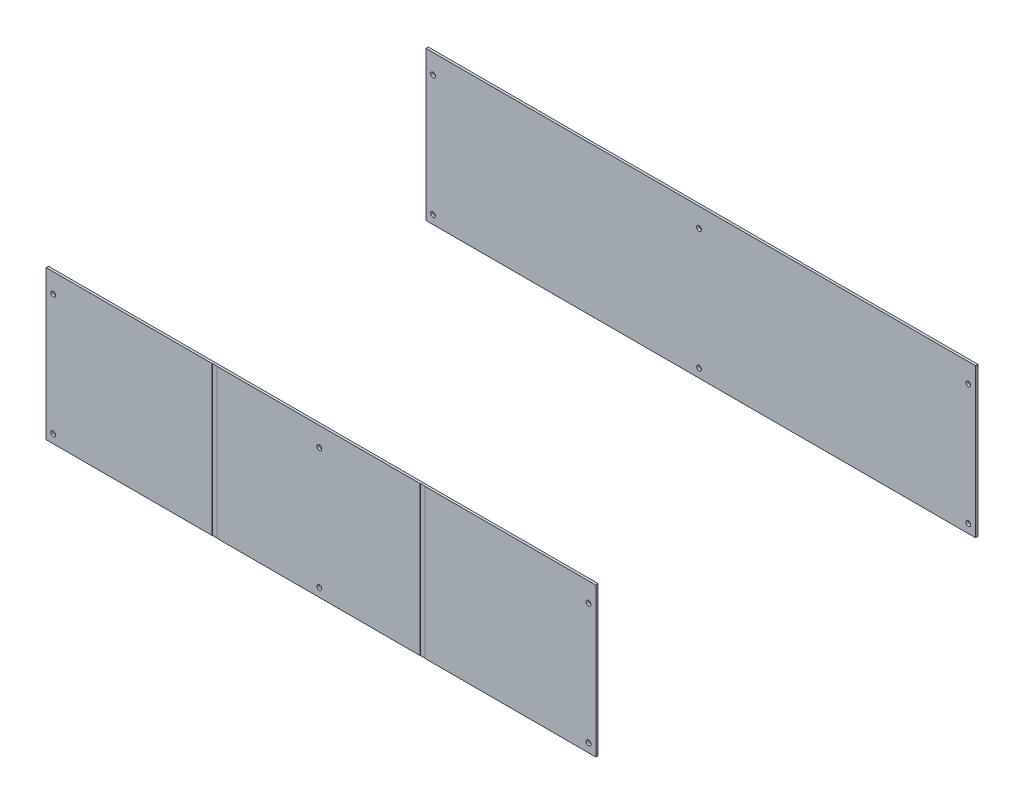
ISO-10303-21;
HEADER;
FILE_DESCRIPTION(('STEP AP214'),'2;1');
FILE_NAME('part.step','',(''),(''),'','','');
FILE_SCHEMA(('AUTOMOTIVE_DESIGN { 1 0 10303 214 1 1 1 1 }'));
ENDSEC;
DATA;
#1=APPLICATION_CONTEXT('core data for automotive mechanical design processes');
#2=APPLICATION_PROTOCOL_DEFINITION('international standard','automotive_design',2000,#1);
#3=PRODUCT_CONTEXT('',#1,'mechanical');
#4=PRODUCT('Part','Part','',(#3));
#5=PRODUCT_RELATED_PRODUCT_CATEGORY('part','',(#4));
#6=PRODUCT_DEFINITION_FORMATION('','',#4);
#7=PRODUCT_DEFINITION_CONTEXT('part definition',#1,'design');
#8=PRODUCT_DEFINITION('design','',#6,#7);
#9=PRODUCT_DEFINITION_SHAPE('','',#8);
#10=(LENGTH_UNIT() NAMED_UNIT(*) SI_UNIT(.MILLI.,.METRE.));
#11=(NAMED_UNIT(*) PLANE_ANGLE_UNIT() SI_UNIT($,.RADIAN.));
#12=(NAMED_UNIT(*) SI_UNIT($,.STERADIAN.) SOLID_ANGLE_UNIT());
#13=UNCERTAINTY_MEASURE_WITH_UNIT(LENGTH_MEASURE(1.E-05),#10,'distance_accuracy_value','');
#14=(GEOMETRIC_REPRESENTATION_CONTEXT(3) GLOBAL_UNCERTAINTY_ASSIGNED_CONTEXT((#13)) GLOBAL_UNIT_ASSIGNED_CONTEXT((#10,
#11,#12)) REPRESENTATION_CONTEXT('',''));
#15=CARTESIAN_POINT('',(0.,0.,0.));
#16=DIRECTION('',(0.,0.,1.));
#17=DIRECTION('',(1.,0.,0.));
#18=AXIS2_PLACEMENT_3D('',#15,#16,#17);
#19=CARTESIAN_POINT('',(0.,0.,-785.));
#20=DIRECTION('',(0.,0.,-1.));
#21=DIRECTION('',(1.,0.,0.));
#22=AXIS2_PLACEMENT_3D('',#19,#20,#21);
#23=PLANE('',#22);
#24=CARTESIAN_POINT('',(-3.2500000000002,114.,-785.));
#25=DIRECTION('',(0.,0.,-1.));
#26=DIRECTION('',(-1.,0.,0.));
#27=AXIS2_PLACEMENT_3D('',#24,#25,#26);
#28=CIRCLE('',#27,5.00000000000005);
#29=CARTESIAN_POINT('',(-8.25000000000024,114.,-785.));
#30=VERTEX_POINT('',#29);
#31=EDGE_CURVE('E299',#30,#30,#28,.T.);
#32=ORIENTED_EDGE('',*,*,#31,.F.);
#33=EDGE_LOOP('',(#32));
#34=FACE_BOUND('',#33,.T.);
#35=CARTESIAN_POINT('',(-3.24999999999998,-136.,-785.));
#36=DIRECTION('',(0.,0.,-1.));
#37=DIRECTION('',(1.,0.,0.));
#38=AXIS2_PLACEMENT_3D('',#35,#36,#37);
#39=CIRCLE('',#38,5.00000000000005);
#40=CARTESIAN_POINT('',(1.75000000000007,-136.,-785.));
#41=VERTEX_POINT('',#40);
#42=EDGE_CURVE('E305',#41,#41,#39,.T.);
#43=ORIENTED_EDGE('',*,*,#42,.F.);
#44=EDGE_LOOP('',(#43));
#45=FACE_BOUND('',#44,.T.);
#46=DIRECTION('',(-1.,0.,0.));
#47=VECTOR('',#46,1.);
#48=CARTESIAN_POINT('',(-568.25,154.,-785.));
#49=LINE('',#48,#47);
#50=CARTESIAN_POINT('',(205.,154.,-785.));
#51=VERTEX_POINT('',#50);
#52=CARTESIAN_POINT('',(-215.,154.,-785.));
#53=VERTEX_POINT('',#52);
#54=EDGE_CURVE('E202',#51,#53,#49,.T.);
#55=ORIENTED_EDGE('',*,*,#54,.F.);
#56=DIRECTION('',(0.,1.,0.));
#57=VECTOR('',#56,1.);
#58=CARTESIAN_POINT('',(205.,154.,-785.));
#59=LINE('',#58,#57);
#60=CARTESIAN_POINT('',(205.,-154.,-785.));
#61=VERTEX_POINT('',#60);
#62=EDGE_CURVE('E183',#51,#61,#59,.F.);
#63=ORIENTED_EDGE('',*,*,#62,.T.);
#64=DIRECTION('',(1.,0.,0.));
#65=VECTOR('',#64,1.);
#66=CARTESIAN_POINT('',(-568.25,-154.,-785.));
#67=LINE('',#66,#65);
#68=CARTESIAN_POINT('',(-215.,-154.,-785.));
#69=VERTEX_POINT('',#68);
#70=EDGE_CURVE('E208',#69,#61,#67,.T.);
#71=ORIENTED_EDGE('',*,*,#70,.F.);
#72=DIRECTION('',(0.,-1.,0.));
#73=VECTOR('',#72,1.);
#74=CARTESIAN_POINT('',(-215.,154.,-785.));
#75=LINE('',#74,#73);
#76=EDGE_CURVE('E148',#53,#69,#75,.T.);
#77=ORIENTED_EDGE('',*,*,#76,.F.);
#78=EDGE_LOOP('',(#55,#63,#71,#77));
#79=FACE_BOUND('',#78,.T.);
#80=ADVANCED_FACE('F44',(#34,#45,#79),#23,.T.);
#81=CARTESIAN_POINT('',(553.25,114.,-785.));
#82=DIRECTION('',(0.,0.,-1.));
#83=DIRECTION('',(-1.,0.,0.));
#84=AXIS2_PLACEMENT_3D('',#81,#82,#83);
#85=CIRCLE('',#84,5.00000000000005);
#86=CARTESIAN_POINT('',(548.25,114.,-785.));
#87=VERTEX_POINT('',#86);
#88=EDGE_CURVE('E284',#87,#87,#85,.T.);
#89=ORIENTED_EDGE('',*,*,#88,.F.);
#90=EDGE_LOOP('',(#89));
#91=FACE_BOUND('',#90,.T.);
#92=CARTESIAN_POINT('',(553.25,-136.,-785.));
#93=DIRECTION('',(0.,0.,-1.));
#94=DIRECTION('',(1.,0.,0.));
#95=AXIS2_PLACEMENT_3D('',#92,#93,#94);
#96=CIRCLE('',#95,5.00000000000005);
#97=CARTESIAN_POINT('',(558.25,-136.,-785.));
#98=VERTEX_POINT('',#97);
#99=EDGE_CURVE('E287',#98,#98,#96,.T.);
#100=ORIENTED_EDGE('',*,*,#99,.F.);
#101=EDGE_LOOP('',(#100));
#102=FACE_BOUND('',#101,.T.);
#103=CARTESIAN_POINT('',(568.25,154.,-785.));
#104=VERTEX_POINT('',#103);
#105=CARTESIAN_POINT('',(215.,154.,-785.));
#106=VERTEX_POINT('',#105);
#107=EDGE_CURVE('E198',#104,#106,#49,.T.);
#108=ORIENTED_EDGE('',*,*,#107,.F.);
#109=DIRECTION('',(0.,1.,0.));
#110=VECTOR('',#109,1.);
#111=CARTESIAN_POINT('',(568.25,154.,-785.));
#112=LINE('',#111,#110);
#113=CARTESIAN_POINT('',(568.25,-154.,-785.));
#114=VERTEX_POINT('',#113);
#115=EDGE_CURVE('E193',#114,#104,#112,.T.);
#116=ORIENTED_EDGE('',*,*,#115,.F.);
#117=CARTESIAN_POINT('',(215.,-154.,-785.));
#118=VERTEX_POINT('',#117);
#119=EDGE_CURVE('E205',#118,#114,#67,.T.);
#120=ORIENTED_EDGE('',*,*,#119,.F.);
#121=DIRECTION('',(0.,-1.,0.));
#122=VECTOR('',#121,1.);
#123=CARTESIAN_POINT('',(215.,154.,-785.));
#124=LINE('',#123,#122);
#125=EDGE_CURVE('E174',#106,#118,#124,.T.);
#126=ORIENTED_EDGE('',*,*,#125,.F.);
#127=EDGE_LOOP('',(#108,#116,#120,#126));
#128=FACE_BOUND('',#127,.T.);
#129=ADVANCED_FACE('F240',(#91,#102,#128),#23,.T.);
#130=CARTESIAN_POINT('',(568.25,154.,-785.));
#131=DIRECTION('',(-1.,0.,0.));
#132=DIRECTION('',(0.,-1.,0.));
#133=AXIS2_PLACEMENT_3D('',#130,#131,#132);
#134=PLANE('',#133);
#135=DIRECTION('',(0.,1.,0.));
#136=VECTOR('',#135,1.);
#137=CARTESIAN_POINT('',(568.25,154.,-780.));
#138=LINE('',#137,#136);
#139=CARTESIAN_POINT('',(568.25,-154.,-780.));
#140=VERTEX_POINT('',#139);
#141=CARTESIAN_POINT('',(568.25,154.,-780.));
#142=VERTEX_POINT('',#141);
#143=EDGE_CURVE('E167',#140,#142,#138,.T.);
#144=ORIENTED_EDGE('',*,*,#143,.F.);
#145=DIRECTION('',(0.,0.,1.));
#146=VECTOR('',#145,1.);
#147=CARTESIAN_POINT('',(568.25,-154.,-785.));
#148=LINE('',#147,#146);
#149=EDGE_CURVE('E207',#114,#140,#148,.T.);
#150=ORIENTED_EDGE('',*,*,#149,.F.);
#151=ORIENTED_EDGE('',*,*,#115,.T.);
#152=DIRECTION('',(0.,0.,1.));
#153=VECTOR('',#152,1.);
#154=CARTESIAN_POINT('',(568.25,154.,-785.));
#155=LINE('',#154,#153);
#156=EDGE_CURVE('E12',#104,#142,#155,.T.);
#157=ORIENTED_EDGE('',*,*,#156,.T.);
#158=EDGE_LOOP('',(#144,#150,#151,#157));
#159=FACE_BOUND('',#158,.T.);
#160=ADVANCED_FACE('F46',(#159),#134,.F.);
#161=CARTESIAN_POINT('',(-568.25,154.,-785.));
#162=DIRECTION('',(0.,-1.,0.));
#163=DIRECTION('',(0.,0.,1.));
#164=AXIS2_PLACEMENT_3D('',#161,#162,#163);
#165=PLANE('',#164);
#166=CARTESIAN_POINT('',(-225.,154.,-785.));
#167=VERTEX_POINT('',#166);
#168=CARTESIAN_POINT('',(-568.25,154.,-785.));
#169=VERTEX_POINT('',#168);
#170=EDGE_CURVE('E196',#167,#169,#49,.T.);
#171=ORIENTED_EDGE('',*,*,#170,.T.);
#172=DIRECTION('',(0.,0.,1.));
#173=VECTOR('',#172,1.);
#174=CARTESIAN_POINT('',(-568.25,154.,-785.));
#175=LINE('',#174,#173);
#176=CARTESIAN_POINT('',(-568.25,154.,-780.));
#177=VERTEX_POINT('',#176);
#178=EDGE_CURVE('E52',#169,#177,#175,.T.);
#179=ORIENTED_EDGE('',*,*,#178,.T.);
#180=DIRECTION('',(-1.,0.,0.));
#181=VECTOR('',#180,1.);
#182=CARTESIAN_POINT('',(-568.25,154.,-780.));
#183=LINE('',#182,#181);
#184=EDGE_CURVE('E211',#142,#177,#183,.T.);
#185=ORIENTED_EDGE('',*,*,#184,.F.);
#186=ORIENTED_EDGE('',*,*,#156,.F.);
#187=ORIENTED_EDGE('',*,*,#107,.T.);
#188=DIRECTION('',(0.,0.,-1.));
#189=VECTOR('',#188,1.);
#190=CARTESIAN_POINT('',(215.,154.,-784.5));
#191=LINE('',#190,#189);
#192=CARTESIAN_POINT('',(215.,154.,-784.5));
#193=VERTEX_POINT('',#192);
#194=EDGE_CURVE('E189',#193,#106,#191,.T.);
#195=ORIENTED_EDGE('',*,*,#194,.F.);
#196=DIRECTION('',(1.,0.,0.));
#197=VECTOR('',#196,1.);
#198=CARTESIAN_POINT('',(205.,154.,-784.5));
#199=LINE('',#198,#197);
#200=CARTESIAN_POINT('',(205.,154.,-784.5));
#201=VERTEX_POINT('',#200);
#202=EDGE_CURVE('E179',#201,#193,#199,.T.);
#203=ORIENTED_EDGE('',*,*,#202,.F.);
#204=DIRECTION('',(0.,0.,-1.));
#205=VECTOR('',#204,1.);
#206=CARTESIAN_POINT('',(205.,154.,-784.5));
#207=LINE('',#206,#205);
#208=EDGE_CURVE('E164',#201,#51,#207,.T.);
#209=ORIENTED_EDGE('',*,*,#208,.T.);
#210=ORIENTED_EDGE('',*,*,#54,.T.);
#211=DIRECTION('',(0.,0.,-1.));
#212=VECTOR('',#211,1.);
#213=CARTESIAN_POINT('',(-215.,154.,-784.5));
#214=LINE('',#213,#212);
#215=CARTESIAN_POINT('',(-215.,154.,-784.5));
#216=VERTEX_POINT('',#215);
#217=EDGE_CURVE('E168',#216,#53,#214,.T.);
#218=ORIENTED_EDGE('',*,*,#217,.F.);
#219=DIRECTION('',(1.,0.,0.));
#220=VECTOR('',#219,1.);
#221=CARTESIAN_POINT('',(-225.,154.,-784.5));
#222=LINE('',#221,#220);
#223=CARTESIAN_POINT('',(-225.,154.,-784.5));
#224=VERTEX_POINT('',#223);
#225=EDGE_CURVE('E153',#224,#216,#222,.T.);
#226=ORIENTED_EDGE('',*,*,#225,.F.);
#227=DIRECTION('',(0.,0.,-1.));
#228=VECTOR('',#227,1.);
#229=CARTESIAN_POINT('',(-225.,154.,-784.5));
#230=LINE('',#229,#228);
#231=EDGE_CURVE('E142',#224,#167,#230,.T.);
#232=ORIENTED_EDGE('',*,*,#231,.T.);
#233=EDGE_LOOP('',(#171,#179,#185,#186,#187,#195,#203,#209,#210,#218,#226,#232));
#234=FACE_BOUND('',#233,.T.);
#235=ADVANCED_FACE('F226',(#234),#165,.F.);
#236=CARTESIAN_POINT('',(-568.25,154.,-785.));
#237=DIRECTION('',(1.,0.,0.));
#238=DIRECTION('',(0.,1.,0.));
#239=AXIS2_PLACEMENT_3D('',#236,#237,#238);
#240=PLANE('',#239);
#241=DIRECTION('',(0.,-1.,0.));
#242=VECTOR('',#241,1.);
#243=CARTESIAN_POINT('',(-568.25,154.,-780.));
#244=LINE('',#243,#242);
#245=CARTESIAN_POINT('',(-568.25,-154.,-780.));
#246=VERTEX_POINT('',#245);
#247=EDGE_CURVE('E214',#177,#246,#244,.T.);
#248=ORIENTED_EDGE('',*,*,#247,.F.);
#249=ORIENTED_EDGE('',*,*,#178,.F.);
#250=DIRECTION('',(0.,-1.,0.));
#251=VECTOR('',#250,1.);
#252=CARTESIAN_POINT('',(-568.25,154.,-785.));
#253=LINE('',#252,#251);
#254=CARTESIAN_POINT('',(-568.25,-154.,-785.));
#255=VERTEX_POINT('',#254);
#256=EDGE_CURVE('E201',#169,#255,#253,.T.);
#257=ORIENTED_EDGE('',*,*,#256,.T.);
#258=DIRECTION('',(0.,0.,1.));
#259=VECTOR('',#258,1.);
#260=CARTESIAN_POINT('',(-568.25,-154.,-785.));
#261=LINE('',#260,#259);
#262=EDGE_CURVE('E220',#255,#246,#261,.T.);
#263=ORIENTED_EDGE('',*,*,#262,.T.);
#264=EDGE_LOOP('',(#248,#249,#257,#263));
#265=FACE_BOUND('',#264,.T.);
#266=ADVANCED_FACE('F229',(#265),#240,.F.);
#267=CARTESIAN_POINT('',(-568.25,-154.,-785.));
#268=DIRECTION('',(0.,1.,0.));
#269=DIRECTION('',(0.,0.,-1.));
#270=AXIS2_PLACEMENT_3D('',#267,#268,#269);
#271=PLANE('',#270);
#272=DIRECTION('',(-1.,0.,0.));
#273=VECTOR('',#272,1.);
#274=CARTESIAN_POINT('',(-215.,-154.,-784.5));
#275=LINE('',#274,#273);
#276=CARTESIAN_POINT('',(-215.,-154.,-784.5));
#277=VERTEX_POINT('',#276);
#278=CARTESIAN_POINT('',(-225.,-154.,-784.5));
#279=VERTEX_POINT('',#278);
#280=EDGE_CURVE('E147',#277,#279,#275,.T.);
#281=ORIENTED_EDGE('',*,*,#280,.F.);
#282=DIRECTION('',(0.,0.,-1.));
#283=VECTOR('',#282,1.);
#284=CARTESIAN_POINT('',(-215.,-154.,-784.5));
#285=LINE('',#284,#283);
#286=EDGE_CURVE('E66',#277,#69,#285,.T.);
#287=ORIENTED_EDGE('',*,*,#286,.T.);
#288=ORIENTED_EDGE('',*,*,#70,.T.);
#289=DIRECTION('',(0.,0.,-1.));
#290=VECTOR('',#289,1.);
#291=CARTESIAN_POINT('',(205.,-154.,-784.5));
#292=LINE('',#291,#290);
#293=CARTESIAN_POINT('',(205.,-154.,-784.5));
#294=VERTEX_POINT('',#293);
#295=EDGE_CURVE('E182',#294,#61,#292,.T.);
#296=ORIENTED_EDGE('',*,*,#295,.F.);
#297=DIRECTION('',(-1.,0.,0.));
#298=VECTOR('',#297,1.);
#299=CARTESIAN_POINT('',(215.,-154.,-784.5));
#300=LINE('',#299,#298);
#301=CARTESIAN_POINT('',(215.,-154.,-784.5));
#302=VERTEX_POINT('',#301);
#303=EDGE_CURVE('E173',#302,#294,#300,.T.);
#304=ORIENTED_EDGE('',*,*,#303,.F.);
#305=DIRECTION('',(0.,0.,-1.));
#306=VECTOR('',#305,1.);
#307=CARTESIAN_POINT('',(215.,-154.,-784.5));
#308=LINE('',#307,#306);
#309=EDGE_CURVE('E59',#302,#118,#308,.T.);
#310=ORIENTED_EDGE('',*,*,#309,.T.);
#311=ORIENTED_EDGE('',*,*,#119,.T.);
#312=ORIENTED_EDGE('',*,*,#149,.T.);
#313=DIRECTION('',(1.,0.,0.));
#314=VECTOR('',#313,1.);
#315=CARTESIAN_POINT('',(-568.25,-154.,-780.));
#316=LINE('',#315,#314);
#317=EDGE_CURVE('E197',#246,#140,#316,.T.);
#318=ORIENTED_EDGE('',*,*,#317,.F.);
#319=ORIENTED_EDGE('',*,*,#262,.F.);
#320=CARTESIAN_POINT('',(-225.,-154.,-785.));
#321=VERTEX_POINT('',#320);
#322=EDGE_CURVE('E152',#255,#321,#67,.T.);
#323=ORIENTED_EDGE('',*,*,#322,.T.);
#324=DIRECTION('',(0.,0.,-1.));
#325=VECTOR('',#324,1.);
#326=CARTESIAN_POINT('',(-225.,-154.,-784.5));
#327=LINE('',#326,#325);
#328=EDGE_CURVE('E139',#279,#321,#327,.T.);
#329=ORIENTED_EDGE('',*,*,#328,.F.);
#330=EDGE_LOOP('',(#281,#287,#288,#296,#304,#310,#311,#312,#318,#319,#323,#329));
#331=FACE_BOUND('',#330,.T.);
#332=ADVANCED_FACE('F150',(#331),#271,.F.);
#333=CARTESIAN_POINT('',(-553.25,114.,-785.));
#334=DIRECTION('',(0.,0.,1.));
#335=DIRECTION('',(1.,0.,0.));
#336=AXIS2_PLACEMENT_3D('',#333,#334,#335);
#337=CIRCLE('',#336,5.00000000000005);
#338=CARTESIAN_POINT('',(-548.25,114.,-785.));
#339=VERTEX_POINT('',#338);
#340=EDGE_CURVE('E311',#339,#339,#337,.T.);
#341=ORIENTED_EDGE('',*,*,#340,.T.);
#342=EDGE_LOOP('',(#341));
#343=FACE_BOUND('',#342,.T.);
#344=CARTESIAN_POINT('',(-553.25,-136.,-785.));
#345=DIRECTION('',(0.,0.,1.));
#346=DIRECTION('',(-1.,0.,0.));
#347=AXIS2_PLACEMENT_3D('',#344,#345,#346);
#348=CIRCLE('',#347,5.00000000000005);
#349=CARTESIAN_POINT('',(-558.25,-136.,-785.));
#350=VERTEX_POINT('',#349);
#351=EDGE_CURVE('E298',#350,#350,#348,.T.);
#352=ORIENTED_EDGE('',*,*,#351,.T.);
#353=EDGE_LOOP('',(#352));
#354=FACE_BOUND('',#353,.T.);
#355=DIRECTION('',(0.,-1.,0.));
#356=VECTOR('',#355,1.);
#357=CARTESIAN_POINT('',(-225.,154.,-785.));
#358=LINE('',#357,#356);
#359=EDGE_CURVE('E162',#167,#321,#358,.T.);
#360=ORIENTED_EDGE('',*,*,#359,.T.);
#361=ORIENTED_EDGE('',*,*,#322,.F.);
#362=ORIENTED_EDGE('',*,*,#256,.F.);
#363=ORIENTED_EDGE('',*,*,#170,.F.);
#364=EDGE_LOOP('',(#360,#361,#362,#363));
#365=FACE_BOUND('',#364,.T.);
#366=ADVANCED_FACE('F260',(#343,#354,#365),#23,.T.);
#367=CARTESIAN_POINT('',(0.,0.,-780.));
#368=DIRECTION('',(0.,0.,-1.));
#369=DIRECTION('',(1.,0.,0.));
#370=AXIS2_PLACEMENT_3D('',#367,#368,#369);
#371=PLANE('',#370);
#372=CARTESIAN_POINT('',(553.25,114.,-780.));
#373=DIRECTION('',(0.,0.,-1.));
#374=DIRECTION('',(-1.,0.,0.));
#375=AXIS2_PLACEMENT_3D('',#372,#373,#374);
#376=CIRCLE('',#375,5.00000000000005);
#377=CARTESIAN_POINT('',(548.25,114.,-780.));
#378=VERTEX_POINT('',#377);
#379=EDGE_CURVE('E308',#378,#378,#376,.T.);
#380=ORIENTED_EDGE('',*,*,#379,.T.);
#381=EDGE_LOOP('',(#380));
#382=FACE_BOUND('',#381,.T.);
#383=CARTESIAN_POINT('',(553.25,-136.,-780.));
#384=DIRECTION('',(0.,0.,-1.));
#385=DIRECTION('',(1.,0.,0.));
#386=AXIS2_PLACEMENT_3D('',#383,#384,#385);
#387=CIRCLE('',#386,5.00000000000005);
#388=CARTESIAN_POINT('',(558.25,-136.,-780.));
#389=VERTEX_POINT('',#388);
#390=EDGE_CURVE('E289',#389,#389,#387,.T.);
#391=ORIENTED_EDGE('',*,*,#390,.T.);
#392=EDGE_LOOP('',(#391));
#393=FACE_BOUND('',#392,.T.);
#394=CARTESIAN_POINT('',(-3.2500000000002,114.,-780.));
#395=DIRECTION('',(0.,0.,-1.));
#396=DIRECTION('',(-1.,0.,0.));
#397=AXIS2_PLACEMENT_3D('',#394,#395,#396);
#398=CIRCLE('',#397,5.00000000000005);
#399=CARTESIAN_POINT('',(-8.25000000000024,114.,-780.));
#400=VERTEX_POINT('',#399);
#401=EDGE_CURVE('E295',#400,#400,#398,.T.);
#402=ORIENTED_EDGE('',*,*,#401,.T.);
#403=EDGE_LOOP('',(#402));
#404=FACE_BOUND('',#403,.T.);
#405=CARTESIAN_POINT('',(-3.24999999999998,-136.,-780.));
#406=DIRECTION('',(0.,0.,-1.));
#407=DIRECTION('',(1.,0.,0.));
#408=AXIS2_PLACEMENT_3D('',#405,#406,#407);
#409=CIRCLE('',#408,5.00000000000005);
#410=CARTESIAN_POINT('',(1.75000000000007,-136.,-780.));
#411=VERTEX_POINT('',#410);
#412=EDGE_CURVE('E302',#411,#411,#409,.T.);
#413=ORIENTED_EDGE('',*,*,#412,.T.);
#414=EDGE_LOOP('',(#413));
#415=FACE_BOUND('',#414,.T.);
#416=CARTESIAN_POINT('',(-553.25,114.,-780.));
#417=DIRECTION('',(0.,0.,1.));
#418=DIRECTION('',(1.,0.,0.));
#419=AXIS2_PLACEMENT_3D('',#416,#417,#418);
#420=CIRCLE('',#419,5.00000000000005);
#421=CARTESIAN_POINT('',(-548.25,114.,-780.));
#422=VERTEX_POINT('',#421);
#423=EDGE_CURVE('E186',#422,#422,#420,.T.);
#424=ORIENTED_EDGE('',*,*,#423,.F.);
#425=EDGE_LOOP('',(#424));
#426=FACE_BOUND('',#425,.T.);
#427=CARTESIAN_POINT('',(-553.25,-136.,-780.));
#428=DIRECTION('',(0.,0.,1.));
#429=DIRECTION('',(-1.,0.,0.));
#430=AXIS2_PLACEMENT_3D('',#427,#428,#429);
#431=CIRCLE('',#430,5.00000000000005);
#432=CARTESIAN_POINT('',(-558.25,-136.,-780.));
#433=VERTEX_POINT('',#432);
#434=EDGE_CURVE('E313',#433,#433,#431,.T.);
#435=ORIENTED_EDGE('',*,*,#434,.F.);
#436=EDGE_LOOP('',(#435));
#437=FACE_BOUND('',#436,.T.);
#438=ORIENTED_EDGE('',*,*,#143,.T.);
#439=ORIENTED_EDGE('',*,*,#184,.T.);
#440=ORIENTED_EDGE('',*,*,#247,.T.);
#441=ORIENTED_EDGE('',*,*,#317,.T.);
#442=EDGE_LOOP('',(#438,#439,#440,#441));
#443=FACE_BOUND('',#442,.T.);
#444=ADVANCED_FACE('F231',(#382,#393,#404,#415,#426,#437,#443),#371,.F.);
#445=CARTESIAN_POINT('',(205.,154.,-784.5));
#446=DIRECTION('',(-1.,0.,0.));
#447=DIRECTION('',(0.,0.,-1.));
#448=AXIS2_PLACEMENT_3D('',#445,#446,#447);
#449=PLANE('',#448);
#450=ORIENTED_EDGE('',*,*,#62,.F.);
#451=ORIENTED_EDGE('',*,*,#208,.F.);
#452=DIRECTION('',(0.,1.,0.));
#453=VECTOR('',#452,1.);
#454=CARTESIAN_POINT('',(205.,154.,-784.5));
#455=LINE('',#454,#453);
#456=EDGE_CURVE('E171',#201,#294,#455,.F.);
#457=ORIENTED_EDGE('',*,*,#456,.T.);
#458=ORIENTED_EDGE('',*,*,#295,.T.);
#459=EDGE_LOOP('',(#450,#451,#457,#458));
#460=FACE_BOUND('',#459,.T.);
#461=ADVANCED_FACE('F252',(#460),#449,.F.);
#462=CARTESIAN_POINT('',(215.,154.,-784.5));
#463=DIRECTION('',(-1.,0.,0.));
#464=DIRECTION('',(0.,0.,-1.));
#465=AXIS2_PLACEMENT_3D('',#462,#463,#464);
#466=PLANE('',#465);
#467=ORIENTED_EDGE('',*,*,#125,.T.);
#468=ORIENTED_EDGE('',*,*,#309,.F.);
#469=DIRECTION('',(0.,-1.,0.));
#470=VECTOR('',#469,1.);
#471=CARTESIAN_POINT('',(215.,154.,-784.5));
#472=LINE('',#471,#470);
#473=EDGE_CURVE('E177',#193,#302,#472,.T.);
#474=ORIENTED_EDGE('',*,*,#473,.F.);
#475=ORIENTED_EDGE('',*,*,#194,.T.);
#476=EDGE_LOOP('',(#467,#468,#474,#475));
#477=FACE_BOUND('',#476,.T.);
#478=ADVANCED_FACE('F243',(#477),#466,.T.);
#479=CARTESIAN_POINT('',(0.,0.,-784.5));
#480=DIRECTION('',(0.,0.,-1.));
#481=DIRECTION('',(1.,0.,0.));
#482=AXIS2_PLACEMENT_3D('',#479,#480,#481);
#483=PLANE('',#482);
#484=ORIENTED_EDGE('',*,*,#456,.F.);
#485=ORIENTED_EDGE('',*,*,#202,.T.);
#486=ORIENTED_EDGE('',*,*,#473,.T.);
#487=ORIENTED_EDGE('',*,*,#303,.T.);
#488=EDGE_LOOP('',(#484,#485,#486,#487));
#489=FACE_BOUND('',#488,.T.);
#490=ADVANCED_FACE('F245',(#489),#483,.T.);
#491=CARTESIAN_POINT('',(-225.,154.,-784.5));
#492=DIRECTION('',(-1.,0.,0.));
#493=DIRECTION('',(0.,-1.,0.));
#494=AXIS2_PLACEMENT_3D('',#491,#492,#493);
#495=PLANE('',#494);
#496=ORIENTED_EDGE('',*,*,#359,.F.);
#497=ORIENTED_EDGE('',*,*,#231,.F.);
#498=DIRECTION('',(0.,-1.,0.));
#499=VECTOR('',#498,1.);
#500=CARTESIAN_POINT('',(-225.,154.,-784.5));
#501=LINE('',#500,#499);
#502=EDGE_CURVE('E136',#224,#279,#501,.T.);
#503=ORIENTED_EDGE('',*,*,#502,.T.);
#504=ORIENTED_EDGE('',*,*,#328,.T.);
#505=EDGE_LOOP('',(#496,#497,#503,#504));
#506=FACE_BOUND('',#505,.T.);
#507=ADVANCED_FACE('F138',(#506),#495,.F.);
#508=CARTESIAN_POINT('',(-215.,154.,-784.5));
#509=DIRECTION('',(-1.,0.,0.));
#510=DIRECTION('',(0.,-1.,0.));
#511=AXIS2_PLACEMENT_3D('',#508,#509,#510);
#512=PLANE('',#511);
#513=ORIENTED_EDGE('',*,*,#76,.T.);
#514=ORIENTED_EDGE('',*,*,#286,.F.);
#515=DIRECTION('',(0.,-1.,0.));
#516=VECTOR('',#515,1.);
#517=CARTESIAN_POINT('',(-215.,154.,-784.5));
#518=LINE('',#517,#516);
#519=EDGE_CURVE('E156',#216,#277,#518,.T.);
#520=ORIENTED_EDGE('',*,*,#519,.F.);
#521=ORIENTED_EDGE('',*,*,#217,.T.);
#522=EDGE_LOOP('',(#513,#514,#520,#521));
#523=FACE_BOUND('',#522,.T.);
#524=ADVANCED_FACE('F258',(#523),#512,.T.);
#525=CARTESIAN_POINT('',(0.,0.,-784.5));
#526=DIRECTION('',(0.,0.,1.));
#527=DIRECTION('',(-1.,0.,0.));
#528=AXIS2_PLACEMENT_3D('',#525,#526,#527);
#529=PLANE('',#528);
#530=ORIENTED_EDGE('',*,*,#502,.F.);
#531=ORIENTED_EDGE('',*,*,#225,.T.);
#532=ORIENTED_EDGE('',*,*,#519,.T.);
#533=ORIENTED_EDGE('',*,*,#280,.T.);
#534=EDGE_LOOP('',(#530,#531,#532,#533));
#535=FACE_BOUND('',#534,.T.);
#536=ADVANCED_FACE('F155',(#535),#529,.F.);
#537=CARTESIAN_POINT('',(-553.25,-136.,-780.));
#538=DIRECTION('',(0.,0.,-1.));
#539=DIRECTION('',(1.,0.,0.));
#540=AXIS2_PLACEMENT_3D('',#537,#538,#539);
#541=CYLINDRICAL_SURFACE('',#540,5.00000000000005);
#542=ORIENTED_EDGE('',*,*,#434,.T.);
#543=EDGE_LOOP('',(#542));
#544=FACE_BOUND('',#543,.T.);
#545=ORIENTED_EDGE('',*,*,#351,.F.);
#546=EDGE_LOOP('',(#545));
#547=FACE_BOUND('',#546,.T.);
#548=ADVANCED_FACE('F318',(#544,#547),#541,.F.);
#549=CARTESIAN_POINT('',(-553.25,114.,-780.));
#550=DIRECTION('',(0.,0.,-1.));
#551=DIRECTION('',(1.,0.,0.));
#552=AXIS2_PLACEMENT_3D('',#549,#550,#551);
#553=CYLINDRICAL_SURFACE('',#552,5.00000000000005);
#554=ORIENTED_EDGE('',*,*,#423,.T.);
#555=EDGE_LOOP('',(#554));
#556=FACE_BOUND('',#555,.T.);
#557=ORIENTED_EDGE('',*,*,#340,.F.);
#558=EDGE_LOOP('',(#557));
#559=FACE_BOUND('',#558,.T.);
#560=ADVANCED_FACE('F320',(#556,#559),#553,.F.);
#561=CARTESIAN_POINT('',(-3.24999999999998,-136.,-780.));
#562=DIRECTION('',(0.,0.,-1.));
#563=DIRECTION('',(1.,0.,0.));
#564=AXIS2_PLACEMENT_3D('',#561,#562,#563);
#565=CYLINDRICAL_SURFACE('',#564,5.00000000000005);
#566=ORIENTED_EDGE('',*,*,#412,.F.);
#567=EDGE_LOOP('',(#566));
#568=FACE_BOUND('',#567,.T.);
#569=ORIENTED_EDGE('',*,*,#42,.T.);
#570=EDGE_LOOP('',(#569));
#571=FACE_BOUND('',#570,.T.);
#572=ADVANCED_FACE('F327',(#568,#571),#565,.F.);
#573=CARTESIAN_POINT('',(-3.2500000000002,114.,-780.));
#574=DIRECTION('',(0.,0.,-1.));
#575=DIRECTION('',(1.,0.,0.));
#576=AXIS2_PLACEMENT_3D('',#573,#574,#575);
#577=CYLINDRICAL_SURFACE('',#576,5.00000000000005);
#578=ORIENTED_EDGE('',*,*,#401,.F.);
#579=EDGE_LOOP('',(#578));
#580=FACE_BOUND('',#579,.T.);
#581=ORIENTED_EDGE('',*,*,#31,.T.);
#582=EDGE_LOOP('',(#581));
#583=FACE_BOUND('',#582,.T.);
#584=ADVANCED_FACE('F387',(#580,#583),#577,.F.);
#585=CARTESIAN_POINT('',(553.25,-136.,-780.));
#586=DIRECTION('',(0.,0.,-1.));
#587=DIRECTION('',(1.,0.,0.));
#588=AXIS2_PLACEMENT_3D('',#585,#586,#587);
#589=CYLINDRICAL_SURFACE('',#588,5.00000000000005);
#590=ORIENTED_EDGE('',*,*,#390,.F.);
#591=EDGE_LOOP('',(#590));
#592=FACE_BOUND('',#591,.T.);
#593=ORIENTED_EDGE('',*,*,#99,.T.);
#594=EDGE_LOOP('',(#593));
#595=FACE_BOUND('',#594,.T.);
#596=ADVANCED_FACE('F397',(#592,#595),#589,.F.);
#597=CARTESIAN_POINT('',(553.25,114.,-780.));
#598=DIRECTION('',(0.,0.,-1.));
#599=DIRECTION('',(1.,0.,0.));
#600=AXIS2_PLACEMENT_3D('',#597,#598,#599);
#601=CYLINDRICAL_SURFACE('',#600,5.00000000000005);
#602=ORIENTED_EDGE('',*,*,#379,.F.);
#603=EDGE_LOOP('',(#602));
#604=FACE_BOUND('',#603,.T.);
#605=ORIENTED_EDGE('',*,*,#88,.T.);
#606=EDGE_LOOP('',(#605));
#607=FACE_BOUND('',#606,.T.);
#608=ADVANCED_FACE('F408',(#604,#607),#601,.F.);
#609=CLOSED_SHELL('',(#80,#129,#160,#235,#266,#332,#366,#444,#461,#478,#490,#507,#524,#536,#548,
#560,#572,#584,#596,#608));
#610=MANIFOLD_SOLID_BREP('B2',#609);
#611=CARTESIAN_POINT('',(0.,0.,5.));
#612=DIRECTION('',(0.,0.,1.));
#613=DIRECTION('',(1.,0.,0.));
#614=AXIS2_PLACEMENT_3D('',#611,#612,#613);
#615=PLANE('',#614);
#616=CARTESIAN_POINT('',(-3.2500000000002,114.,5.));
#617=DIRECTION('',(0.,0.,-1.));
#618=DIRECTION('',(-1.,0.,0.));
#619=AXIS2_PLACEMENT_3D('',#616,#617,#618);
#620=CIRCLE('',#619,5.00000000000005);
#621=CARTESIAN_POINT('',(-8.25000000000024,114.,5.));
#622=VERTEX_POINT('',#621);
#623=EDGE_CURVE('E788',#622,#622,#620,.T.);
#624=ORIENTED_EDGE('',*,*,#623,.T.);
#625=EDGE_LOOP('',(#624));
#626=FACE_BOUND('',#625,.T.);
#627=CARTESIAN_POINT('',(-3.24999999999998,-136.,5.));
#628=DIRECTION('',(0.,0.,-1.));
#629=DIRECTION('',(1.,0.,0.));
#630=AXIS2_PLACEMENT_3D('',#627,#628,#629);
#631=CIRCLE('',#630,5.00000000000005);
#632=CARTESIAN_POINT('',(1.75000000000007,-136.,5.));
#633=VERTEX_POINT('',#632);
#634=EDGE_CURVE('E794',#633,#633,#631,.T.);
#635=ORIENTED_EDGE('',*,*,#634,.T.);
#636=EDGE_LOOP('',(#635));
#637=FACE_BOUND('',#636,.T.);
#638=DIRECTION('',(-1.,0.,0.));
#639=VECTOR('',#638,1.);
#640=CARTESIAN_POINT('',(-568.25,154.,5.));
#641=LINE('',#640,#639);
#642=CARTESIAN_POINT('',(205.,154.,5.));
#643=VERTEX_POINT('',#642);
#644=CARTESIAN_POINT('',(-215.,154.,5.));
#645=VERTEX_POINT('',#644);
#646=EDGE_CURVE('E696',#643,#645,#641,.T.);
#647=ORIENTED_EDGE('',*,*,#646,.T.);
#648=DIRECTION('',(0.,-1.,0.));
#649=VECTOR('',#648,1.);
#650=CARTESIAN_POINT('',(-215.,154.,5.));
#651=LINE('',#650,#649);
#652=CARTESIAN_POINT('',(-215.,-154.,5.));
#653=VERTEX_POINT('',#652);
#654=EDGE_CURVE('E643',#645,#653,#651,.T.);
#655=ORIENTED_EDGE('',*,*,#654,.T.);
#656=DIRECTION('',(1.,0.,0.));
#657=VECTOR('',#656,1.);
#658=CARTESIAN_POINT('',(-568.25,-154.,5.));
#659=LINE('',#658,#657);
#660=CARTESIAN_POINT('',(205.,-154.,5.));
#661=VERTEX_POINT('',#660);
#662=EDGE_CURVE('E702',#653,#661,#659,.T.);
#663=ORIENTED_EDGE('',*,*,#662,.T.);
#664=DIRECTION('',(0.,1.,0.));
#665=VECTOR('',#664,1.);
#666=CARTESIAN_POINT('',(205.,154.,5.));
#667=LINE('',#666,#665);
#668=EDGE_CURVE('E676',#643,#661,#667,.F.);
#669=ORIENTED_EDGE('',*,*,#668,.F.);
#670=EDGE_LOOP('',(#647,#655,#663,#669));
#671=FACE_BOUND('',#670,.T.);
#672=ADVANCED_FACE('F535',(#626,#637,#671),#615,.T.);
#673=CARTESIAN_POINT('',(553.25,114.,5.));
#674=DIRECTION('',(0.,0.,-1.));
#675=DIRECTION('',(-1.,0.,0.));
#676=AXIS2_PLACEMENT_3D('',#673,#674,#675);
#677=CIRCLE('',#676,5.00000000000005);
#678=CARTESIAN_POINT('',(548.25,114.,5.));
#679=VERTEX_POINT('',#678);
#680=EDGE_CURVE('E773',#679,#679,#677,.T.);
#681=ORIENTED_EDGE('',*,*,#680,.T.);
#682=EDGE_LOOP('',(#681));
#683=FACE_BOUND('',#682,.T.);
#684=CARTESIAN_POINT('',(553.25,-136.,5.));
#685=DIRECTION('',(0.,0.,-1.));
#686=DIRECTION('',(1.,0.,0.));
#687=AXIS2_PLACEMENT_3D('',#684,#685,#686);
#688=CIRCLE('',#687,5.00000000000005);
#689=CARTESIAN_POINT('',(558.25,-136.,5.));
#690=VERTEX_POINT('',#689);
#691=EDGE_CURVE('E776',#690,#690,#688,.T.);
#692=ORIENTED_EDGE('',*,*,#691,.T.);
#693=EDGE_LOOP('',(#692));
#694=FACE_BOUND('',#693,.T.);
#695=CARTESIAN_POINT('',(568.25,154.,5.));
#696=VERTEX_POINT('',#695);
#697=CARTESIAN_POINT('',(215.,154.,5.));
#698=VERTEX_POINT('',#697);
#699=EDGE_CURVE('E692',#696,#698,#641,.T.);
#700=ORIENTED_EDGE('',*,*,#699,.T.);
#701=DIRECTION('',(0.,-1.,0.));
#702=VECTOR('',#701,1.);
#703=CARTESIAN_POINT('',(215.,154.,5.));
#704=LINE('',#703,#702);
#705=CARTESIAN_POINT('',(215.,-154.,5.));
#706=VERTEX_POINT('',#705);
#707=EDGE_CURVE('E667',#698,#706,#704,.T.);
#708=ORIENTED_EDGE('',*,*,#707,.T.);
#709=CARTESIAN_POINT('',(568.25,-154.,5.));
#710=VERTEX_POINT('',#709);
#711=EDGE_CURVE('E698',#706,#710,#659,.T.);
#712=ORIENTED_EDGE('',*,*,#711,.T.);
#713=DIRECTION('',(0.,1.,0.));
#714=VECTOR('',#713,1.);
#715=CARTESIAN_POINT('',(568.25,154.,5.));
#716=LINE('',#715,#714);
#717=EDGE_CURVE('E687',#710,#696,#716,.T.);
#718=ORIENTED_EDGE('',*,*,#717,.T.);
#719=EDGE_LOOP('',(#700,#708,#712,#718));
#720=FACE_BOUND('',#719,.T.);
#721=ADVANCED_FACE('F733',(#683,#694,#720),#615,.T.);
#722=CARTESIAN_POINT('',(568.25,154.,5.));
#723=DIRECTION('',(-1.,0.,0.));
#724=DIRECTION('',(0.,-1.,0.));
#725=AXIS2_PLACEMENT_3D('',#722,#723,#724);
#726=PLANE('',#725);
#727=DIRECTION('',(0.,1.,0.));
#728=VECTOR('',#727,1.);
#729=CARTESIAN_POINT('',(568.25,154.,0.));
#730=LINE('',#729,#728);
#731=CARTESIAN_POINT('',(568.25,-154.,0.));
#732=VERTEX_POINT('',#731);
#733=CARTESIAN_POINT('',(568.25,154.,0.));
#734=VERTEX_POINT('',#733);
#735=EDGE_CURVE('E658',#732,#734,#730,.T.);
#736=ORIENTED_EDGE('',*,*,#735,.T.);
#737=DIRECTION('',(0.,0.,-1.));
#738=VECTOR('',#737,1.);
#739=CARTESIAN_POINT('',(568.25,154.,5.));
#740=LINE('',#739,#738);
#741=EDGE_CURVE('E42',#696,#734,#740,.T.);
#742=ORIENTED_EDGE('',*,*,#741,.F.);
#743=ORIENTED_EDGE('',*,*,#717,.F.);
#744=DIRECTION('',(0.,0.,-1.));
#745=VECTOR('',#744,1.);
#746=CARTESIAN_POINT('',(568.25,-154.,5.));
#747=LINE('',#746,#745);
#748=EDGE_CURVE('E701',#710,#732,#747,.T.);
#749=ORIENTED_EDGE('',*,*,#748,.T.);
#750=EDGE_LOOP('',(#736,#742,#743,#749));
#751=FACE_BOUND('',#750,.T.);
#752=ADVANCED_FACE('F537',(#751),#726,.F.);
#753=CARTESIAN_POINT('',(-568.25,154.,5.));
#754=DIRECTION('',(0.,-1.,0.));
#755=DIRECTION('',(0.,0.,-1.));
#756=AXIS2_PLACEMENT_3D('',#753,#754,#755);
#757=PLANE('',#756);
#758=CARTESIAN_POINT('',(-225.,154.,5.));
#759=VERTEX_POINT('',#758);
#760=CARTESIAN_POINT('',(-568.25,154.,5.));
#761=VERTEX_POINT('',#760);
#762=EDGE_CURVE('E690',#759,#761,#641,.T.);
#763=ORIENTED_EDGE('',*,*,#762,.F.);
#764=DIRECTION('',(0.,0.,1.));
#765=VECTOR('',#764,1.);
#766=CARTESIAN_POINT('',(-225.,154.,4.5));
#767=LINE('',#766,#765);
#768=CARTESIAN_POINT('',(-225.,154.,4.5));
#769=VERTEX_POINT('',#768);
#770=EDGE_CURVE('E656',#769,#759,#767,.T.);
#771=ORIENTED_EDGE('',*,*,#770,.F.);
#772=DIRECTION('',(1.,0.,0.));
#773=VECTOR('',#772,1.);
#774=CARTESIAN_POINT('',(-225.,154.,4.5));
#775=LINE('',#774,#773);
#776=CARTESIAN_POINT('',(-215.,154.,4.5));
#777=VERTEX_POINT('',#776);
#778=EDGE_CURVE('E635',#769,#777,#775,.T.);
#779=ORIENTED_EDGE('',*,*,#778,.T.);
#780=DIRECTION('',(0.,0.,1.));
#781=VECTOR('',#780,1.);
#782=CARTESIAN_POINT('',(-215.,154.,4.5));
#783=LINE('',#782,#781);
#784=EDGE_CURVE('E659',#777,#645,#783,.T.);
#785=ORIENTED_EDGE('',*,*,#784,.T.);
#786=ORIENTED_EDGE('',*,*,#646,.F.);
#787=DIRECTION('',(0.,0.,1.));
#788=VECTOR('',#787,1.);
#789=CARTESIAN_POINT('',(205.,154.,4.5));
#790=LINE('',#789,#788);
#791=CARTESIAN_POINT('',(205.,154.,4.5));
#792=VERTEX_POINT('',#791);
#793=EDGE_CURVE('E654',#792,#643,#790,.T.);
#794=ORIENTED_EDGE('',*,*,#793,.F.);
#795=DIRECTION('',(1.,0.,0.));
#796=VECTOR('',#795,1.);
#797=CARTESIAN_POINT('',(205.,154.,4.5));
#798=LINE('',#797,#796);
#799=CARTESIAN_POINT('',(215.,154.,4.5));
#800=VERTEX_POINT('',#799);
#801=EDGE_CURVE('E672',#792,#800,#798,.T.);
#802=ORIENTED_EDGE('',*,*,#801,.T.);
#803=DIRECTION('',(0.,0.,1.));
#804=VECTOR('',#803,1.);
#805=CARTESIAN_POINT('',(215.,154.,4.5));
#806=LINE('',#805,#804);
#807=EDGE_CURVE('E681',#800,#698,#806,.T.);
#808=ORIENTED_EDGE('',*,*,#807,.T.);
#809=ORIENTED_EDGE('',*,*,#699,.F.);
#810=ORIENTED_EDGE('',*,*,#741,.T.);
#811=DIRECTION('',(-1.,0.,0.));
#812=VECTOR('',#811,1.);
#813=CARTESIAN_POINT('',(-568.25,154.,0.));
#814=LINE('',#813,#812);
#815=CARTESIAN_POINT('',(-568.25,154.,0.));
#816=VERTEX_POINT('',#815);
#817=EDGE_CURVE('E705',#734,#816,#814,.T.);
#818=ORIENTED_EDGE('',*,*,#817,.T.);
#819=DIRECTION('',(0.,0.,-1.));
#820=VECTOR('',#819,1.);
#821=CARTESIAN_POINT('',(-568.25,154.,5.));
#822=LINE('',#821,#820);
#823=EDGE_CURVE('E543',#761,#816,#822,.T.);
#824=ORIENTED_EDGE('',*,*,#823,.F.);
#825=EDGE_LOOP('',(#763,#771,#779,#785,#786,#794,#802,#808,#809,#810,#818,#824));
#826=FACE_BOUND('',#825,.T.);
#827=ADVANCED_FACE('F747',(#826),#757,.F.);
#828=CARTESIAN_POINT('',(-568.25,154.,5.));
#829=DIRECTION('',(1.,0.,0.));
#830=DIRECTION('',(0.,1.,0.));
#831=AXIS2_PLACEMENT_3D('',#828,#829,#830);
#832=PLANE('',#831);
#833=DIRECTION('',(0.,-1.,0.));
#834=VECTOR('',#833,1.);
#835=CARTESIAN_POINT('',(-568.25,154.,0.));
#836=LINE('',#835,#834);
#837=CARTESIAN_POINT('',(-568.25,-154.,0.));
#838=VERTEX_POINT('',#837);
#839=EDGE_CURVE('E707',#816,#838,#836,.T.);
#840=ORIENTED_EDGE('',*,*,#839,.T.);
#841=DIRECTION('',(0.,0.,-1.));
#842=VECTOR('',#841,1.);
#843=CARTESIAN_POINT('',(-568.25,-154.,5.));
#844=LINE('',#843,#842);
#845=CARTESIAN_POINT('',(-568.25,-154.,5.));
#846=VERTEX_POINT('',#845);
#847=EDGE_CURVE('E712',#846,#838,#844,.T.);
#848=ORIENTED_EDGE('',*,*,#847,.F.);
#849=DIRECTION('',(0.,-1.,0.));
#850=VECTOR('',#849,1.);
#851=CARTESIAN_POINT('',(-568.25,154.,5.));
#852=LINE('',#851,#850);
#853=EDGE_CURVE('E695',#761,#846,#852,.T.);
#854=ORIENTED_EDGE('',*,*,#853,.F.);
#855=ORIENTED_EDGE('',*,*,#823,.T.);
#856=EDGE_LOOP('',(#840,#848,#854,#855));
#857=FACE_BOUND('',#856,.T.);
#858=ADVANCED_FACE('F719',(#857),#832,.F.);
#859=CARTESIAN_POINT('',(-568.25,-154.,5.));
#860=DIRECTION('',(0.,1.,0.));
#861=DIRECTION('',(0.,0.,1.));
#862=AXIS2_PLACEMENT_3D('',#859,#860,#861);
#863=PLANE('',#862);
#864=DIRECTION('',(-1.,0.,0.));
#865=VECTOR('',#864,1.);
#866=CARTESIAN_POINT('',(-215.,-154.,4.5));
#867=LINE('',#866,#865);
#868=CARTESIAN_POINT('',(-215.,-154.,4.5));
#869=VERTEX_POINT('',#868);
#870=CARTESIAN_POINT('',(-225.,-154.,4.5));
#871=VERTEX_POINT('',#870);
#872=EDGE_CURVE('E641',#869,#871,#867,.T.);
#873=ORIENTED_EDGE('',*,*,#872,.T.);
#874=DIRECTION('',(0.,0.,1.));
#875=VECTOR('',#874,1.);
#876=CARTESIAN_POINT('',(-225.,-154.,4.5));
#877=LINE('',#876,#875);
#878=CARTESIAN_POINT('',(-225.,-154.,5.));
#879=VERTEX_POINT('',#878);
#880=EDGE_CURVE('E624',#871,#879,#877,.T.);
#881=ORIENTED_EDGE('',*,*,#880,.T.);
#882=EDGE_CURVE('E699',#846,#879,#659,.T.);
#883=ORIENTED_EDGE('',*,*,#882,.F.);
#884=ORIENTED_EDGE('',*,*,#847,.T.);
#885=DIRECTION('',(1.,0.,0.));
#886=VECTOR('',#885,1.);
#887=CARTESIAN_POINT('',(-568.25,-154.,0.));
#888=LINE('',#887,#886);
#889=EDGE_CURVE('E691',#838,#732,#888,.T.);
#890=ORIENTED_EDGE('',*,*,#889,.T.);
#891=ORIENTED_EDGE('',*,*,#748,.F.);
#892=ORIENTED_EDGE('',*,*,#711,.F.);
#893=DIRECTION('',(0.,0.,1.));
#894=VECTOR('',#893,1.);
#895=CARTESIAN_POINT('',(215.,-154.,4.5));
#896=LINE('',#895,#894);
#897=CARTESIAN_POINT('',(215.,-154.,4.5));
#898=VERTEX_POINT('',#897);
#899=EDGE_CURVE('E550',#898,#706,#896,.T.);
#900=ORIENTED_EDGE('',*,*,#899,.F.);
#901=DIRECTION('',(-1.,0.,0.));
#902=VECTOR('',#901,1.);
#903=CARTESIAN_POINT('',(215.,-154.,4.5));
#904=LINE('',#903,#902);
#905=CARTESIAN_POINT('',(205.,-154.,4.5));
#906=VERTEX_POINT('',#905);
#907=EDGE_CURVE('E666',#898,#906,#904,.T.);
#908=ORIENTED_EDGE('',*,*,#907,.T.);
#909=DIRECTION('',(0.,0.,1.));
#910=VECTOR('',#909,1.);
#911=CARTESIAN_POINT('',(205.,-154.,4.5));
#912=LINE('',#911,#910);
#913=EDGE_CURVE('E675',#906,#661,#912,.T.);
#914=ORIENTED_EDGE('',*,*,#913,.T.);
#915=ORIENTED_EDGE('',*,*,#662,.F.);
#916=DIRECTION('',(0.,0.,1.));
#917=VECTOR('',#916,1.);
#918=CARTESIAN_POINT('',(-215.,-154.,4.5));
#919=LINE('',#918,#917);
#920=EDGE_CURVE('E558',#869,#653,#919,.T.);
#921=ORIENTED_EDGE('',*,*,#920,.F.);
#922=EDGE_LOOP('',(#873,#881,#883,#884,#890,#891,#892,#900,#908,#914,#915,#921));
#923=FACE_BOUND('',#922,.T.);
#924=ADVANCED_FACE('F645',(#923),#863,.F.);
#925=CARTESIAN_POINT('',(-553.25,114.,5.));
#926=DIRECTION('',(0.,0.,1.));
#927=DIRECTION('',(1.,0.,0.));
#928=AXIS2_PLACEMENT_3D('',#925,#926,#927);
#929=CIRCLE('',#928,5.00000000000005);
#930=CARTESIAN_POINT('',(-548.25,114.,5.));
#931=VERTEX_POINT('',#930);
#932=EDGE_CURVE('E800',#931,#931,#929,.T.);
#933=ORIENTED_EDGE('',*,*,#932,.F.);
#934=EDGE_LOOP('',(#933));
#935=FACE_BOUND('',#934,.T.);
#936=CARTESIAN_POINT('',(-553.25,-136.,5.));
#937=DIRECTION('',(0.,0.,1.));
#938=DIRECTION('',(-1.,0.,0.));
#939=AXIS2_PLACEMENT_3D('',#936,#937,#938);
#940=CIRCLE('',#939,5.00000000000005);
#941=CARTESIAN_POINT('',(-558.25,-136.,5.));
#942=VERTEX_POINT('',#941);
#943=EDGE_CURVE('E787',#942,#942,#940,.T.);
#944=ORIENTED_EDGE('',*,*,#943,.F.);
#945=EDGE_LOOP('',(#944));
#946=FACE_BOUND('',#945,.T.);
#947=DIRECTION('',(0.,-1.,0.));
#948=VECTOR('',#947,1.);
#949=CARTESIAN_POINT('',(-225.,154.,5.));
#950=LINE('',#949,#948);
#951=EDGE_CURVE('E630',#759,#879,#950,.T.);
#952=ORIENTED_EDGE('',*,*,#951,.F.);
#953=ORIENTED_EDGE('',*,*,#762,.T.);
#954=ORIENTED_EDGE('',*,*,#853,.T.);
#955=ORIENTED_EDGE('',*,*,#882,.T.);
#956=EDGE_LOOP('',(#952,#953,#954,#955));
#957=FACE_BOUND('',#956,.T.);
#958=ADVANCED_FACE('F749',(#935,#946,#957),#615,.T.);
#959=CARTESIAN_POINT('',(0.,0.,0.));
#960=DIRECTION('',(0.,0.,1.));
#961=DIRECTION('',(1.,0.,0.));
#962=AXIS2_PLACEMENT_3D('',#959,#960,#961);
#963=PLANE('',#962);
#964=CARTESIAN_POINT('',(553.25,114.,0.));
#965=DIRECTION('',(0.,0.,-1.));
#966=DIRECTION('',(-1.,0.,0.));
#967=AXIS2_PLACEMENT_3D('',#964,#965,#966);
#968=CIRCLE('',#967,5.00000000000005);
#969=CARTESIAN_POINT('',(548.25,114.,0.));
#970=VERTEX_POINT('',#969);
#971=EDGE_CURVE('E797',#970,#970,#968,.T.);
#972=ORIENTED_EDGE('',*,*,#971,.F.);
#973=EDGE_LOOP('',(#972));
#974=FACE_BOUND('',#973,.T.);
#975=CARTESIAN_POINT('',(553.25,-136.,0.));
#976=DIRECTION('',(0.,0.,-1.));
#977=DIRECTION('',(1.,0.,0.));
#978=AXIS2_PLACEMENT_3D('',#975,#976,#977);
#979=CIRCLE('',#978,5.00000000000005);
#980=CARTESIAN_POINT('',(558.25,-136.,0.));
#981=VERTEX_POINT('',#980);
#982=EDGE_CURVE('E778',#981,#981,#979,.T.);
#983=ORIENTED_EDGE('',*,*,#982,.F.);
#984=EDGE_LOOP('',(#983));
#985=FACE_BOUND('',#984,.T.);
#986=CARTESIAN_POINT('',(-3.2500000000002,114.,0.));
#987=DIRECTION('',(0.,0.,-1.));
#988=DIRECTION('',(-1.,0.,0.));
#989=AXIS2_PLACEMENT_3D('',#986,#987,#988);
#990=CIRCLE('',#989,5.00000000000005);
#991=CARTESIAN_POINT('',(-8.25000000000024,114.,0.));
#992=VERTEX_POINT('',#991);
#993=EDGE_CURVE('E784',#992,#992,#990,.T.);
#994=ORIENTED_EDGE('',*,*,#993,.F.);
#995=EDGE_LOOP('',(#994));
#996=FACE_BOUND('',#995,.T.);
#997=CARTESIAN_POINT('',(-3.24999999999998,-136.,0.));
#998=DIRECTION('',(0.,0.,-1.));
#999=DIRECTION('',(1.,0.,0.));
#1000=AXIS2_PLACEMENT_3D('',#997,#998,#999);
#1001=CIRCLE('',#1000,5.00000000000005);
#1002=CARTESIAN_POINT('',(1.75000000000007,-136.,0.));
#1003=VERTEX_POINT('',#1002);
#1004=EDGE_CURVE('E791',#1003,#1003,#1001,.T.);
#1005=ORIENTED_EDGE('',*,*,#1004,.F.);
#1006=EDGE_LOOP('',(#1005));
#1007=FACE_BOUND('',#1006,.T.);
#1008=CARTESIAN_POINT('',(-553.25,114.,0.));
#1009=DIRECTION('',(0.,0.,1.));
#1010=DIRECTION('',(1.,0.,0.));
#1011=AXIS2_PLACEMENT_3D('',#1008,#1009,#1010);
#1012=CIRCLE('',#1011,5.00000000000005);
#1013=CARTESIAN_POINT('',(-548.25,114.,0.));
#1014=VERTEX_POINT('',#1013);
#1015=EDGE_CURVE('E678',#1014,#1014,#1012,.T.);
#1016=ORIENTED_EDGE('',*,*,#1015,.T.);
#1017=EDGE_LOOP('',(#1016));
#1018=FACE_BOUND('',#1017,.T.);
#1019=CARTESIAN_POINT('',(-553.25,-136.,0.));
#1020=DIRECTION('',(0.,0.,1.));
#1021=DIRECTION('',(-1.,0.,0.));
#1022=AXIS2_PLACEMENT_3D('',#1019,#1020,#1021);
#1023=CIRCLE('',#1022,5.00000000000005);
#1024=CARTESIAN_POINT('',(-558.25,-136.,0.));
#1025=VERTEX_POINT('',#1024);
#1026=EDGE_CURVE('E803',#1025,#1025,#1023,.T.);
#1027=ORIENTED_EDGE('',*,*,#1026,.T.);
#1028=EDGE_LOOP('',(#1027));
#1029=FACE_BOUND('',#1028,.T.);
#1030=ORIENTED_EDGE('',*,*,#735,.F.);
#1031=ORIENTED_EDGE('',*,*,#889,.F.);
#1032=ORIENTED_EDGE('',*,*,#839,.F.);
#1033=ORIENTED_EDGE('',*,*,#817,.F.);
#1034=EDGE_LOOP('',(#1030,#1031,#1032,#1033));
#1035=FACE_BOUND('',#1034,.T.);
#1036=ADVANCED_FACE('F726',(#974,#985,#996,#1007,#1018,#1029,#1035),#963,.F.);
#1037=CARTESIAN_POINT('',(205.,154.,4.5));
#1038=DIRECTION('',(-1.,0.,0.));
#1039=DIRECTION('',(0.,0.,1.));
#1040=AXIS2_PLACEMENT_3D('',#1037,#1038,#1039);
#1041=PLANE('',#1040);
#1042=ORIENTED_EDGE('',*,*,#668,.T.);
#1043=ORIENTED_EDGE('',*,*,#913,.F.);
#1044=DIRECTION('',(0.,1.,0.));
#1045=VECTOR('',#1044,1.);
#1046=CARTESIAN_POINT('',(205.,154.,4.5));
#1047=LINE('',#1046,#1045);
#1048=EDGE_CURVE('E663',#792,#906,#1047,.F.);
#1049=ORIENTED_EDGE('',*,*,#1048,.F.);
#1050=ORIENTED_EDGE('',*,*,#793,.T.);
#1051=EDGE_LOOP('',(#1042,#1043,#1049,#1050));
#1052=FACE_BOUND('',#1051,.T.);
#1053=ADVANCED_FACE('F742',(#1052),#1041,.F.);
#1054=CARTESIAN_POINT('',(215.,154.,4.5));
#1055=DIRECTION('',(-1.,0.,0.));
#1056=DIRECTION('',(0.,0.,1.));
#1057=AXIS2_PLACEMENT_3D('',#1054,#1055,#1056);
#1058=PLANE('',#1057);
#1059=ORIENTED_EDGE('',*,*,#707,.F.);
#1060=ORIENTED_EDGE('',*,*,#807,.F.);
#1061=DIRECTION('',(0.,-1.,0.));
#1062=VECTOR('',#1061,1.);
#1063=CARTESIAN_POINT('',(215.,154.,4.5));
#1064=LINE('',#1063,#1062);
#1065=EDGE_CURVE('E670',#800,#898,#1064,.T.);
#1066=ORIENTED_EDGE('',*,*,#1065,.T.);
#1067=ORIENTED_EDGE('',*,*,#899,.T.);
#1068=EDGE_LOOP('',(#1059,#1060,#1066,#1067));
#1069=FACE_BOUND('',#1068,.T.);
#1070=ADVANCED_FACE('F831',(#1069),#1058,.T.);
#1071=CARTESIAN_POINT('',(0.,0.,4.5));
#1072=DIRECTION('',(0.,0.,1.));
#1073=DIRECTION('',(1.,0.,0.));
#1074=AXIS2_PLACEMENT_3D('',#1071,#1072,#1073);
#1075=PLANE('',#1074);
#1076=ORIENTED_EDGE('',*,*,#1048,.T.);
#1077=ORIENTED_EDGE('',*,*,#907,.F.);
#1078=ORIENTED_EDGE('',*,*,#1065,.F.);
#1079=ORIENTED_EDGE('',*,*,#801,.F.);
#1080=EDGE_LOOP('',(#1076,#1077,#1078,#1079));
#1081=FACE_BOUND('',#1080,.T.);
#1082=ADVANCED_FACE('F745',(#1081),#1075,.T.);
#1083=CARTESIAN_POINT('',(-225.,154.,4.5));
#1084=DIRECTION('',(-1.,0.,0.));
#1085=DIRECTION('',(0.,-1.,0.));
#1086=AXIS2_PLACEMENT_3D('',#1083,#1084,#1085);
#1087=PLANE('',#1086);
#1088=ORIENTED_EDGE('',*,*,#951,.T.);
#1089=ORIENTED_EDGE('',*,*,#880,.F.);
#1090=DIRECTION('',(0.,-1.,0.));
#1091=VECTOR('',#1090,1.);
#1092=CARTESIAN_POINT('',(-225.,154.,4.5));
#1093=LINE('',#1092,#1091);
#1094=EDGE_CURVE('E627',#769,#871,#1093,.T.);
#1095=ORIENTED_EDGE('',*,*,#1094,.F.);
#1096=ORIENTED_EDGE('',*,*,#770,.T.);
#1097=EDGE_LOOP('',(#1088,#1089,#1095,#1096));
#1098=FACE_BOUND('',#1097,.T.);
#1099=ADVANCED_FACE('F626',(#1098),#1087,.F.);
#1100=CARTESIAN_POINT('',(-215.,154.,4.5));
#1101=DIRECTION('',(-1.,0.,0.));
#1102=DIRECTION('',(0.,-1.,0.));
#1103=AXIS2_PLACEMENT_3D('',#1100,#1101,#1102);
#1104=PLANE('',#1103);
#1105=ORIENTED_EDGE('',*,*,#654,.F.);
#1106=ORIENTED_EDGE('',*,*,#784,.F.);
#1107=DIRECTION('',(0.,-1.,0.));
#1108=VECTOR('',#1107,1.);
#1109=CARTESIAN_POINT('',(-215.,154.,4.5));
#1110=LINE('',#1109,#1108);
#1111=EDGE_CURVE('E647',#777,#869,#1110,.T.);
#1112=ORIENTED_EDGE('',*,*,#1111,.T.);
#1113=ORIENTED_EDGE('',*,*,#920,.T.);
#1114=EDGE_LOOP('',(#1105,#1106,#1112,#1113));
#1115=FACE_BOUND('',#1114,.T.);
#1116=ADVANCED_FACE('F820',(#1115),#1104,.T.);
#1117=CARTESIAN_POINT('',(0.,0.,4.5));
#1118=DIRECTION('',(0.,0.,-1.));
#1119=DIRECTION('',(-1.,0.,0.));
#1120=AXIS2_PLACEMENT_3D('',#1117,#1118,#1119);
#1121=PLANE('',#1120);
#1122=ORIENTED_EDGE('',*,*,#1094,.T.);
#1123=ORIENTED_EDGE('',*,*,#872,.F.);
#1124=ORIENTED_EDGE('',*,*,#1111,.F.);
#1125=ORIENTED_EDGE('',*,*,#778,.F.);
#1126=EDGE_LOOP('',(#1122,#1123,#1124,#1125));
#1127=FACE_BOUND('',#1126,.T.);
#1128=ADVANCED_FACE('F639',(#1127),#1121,.F.);
#1129=CARTESIAN_POINT('',(-553.25,-136.,0.));
#1130=DIRECTION('',(0.,0.,1.));
#1131=DIRECTION('',(1.,0.,0.));
#1132=AXIS2_PLACEMENT_3D('',#1129,#1130,#1131);
#1133=CYLINDRICAL_SURFACE('',#1132,5.00000000000005);
#1134=ORIENTED_EDGE('',*,*,#1026,.F.);
#1135=EDGE_LOOP('',(#1134));
#1136=FACE_BOUND('',#1135,.T.);
#1137=ORIENTED_EDGE('',*,*,#943,.T.);
#1138=EDGE_LOOP('',(#1137));
#1139=FACE_BOUND('',#1138,.T.);
#1140=ADVANCED_FACE('F808',(#1136,#1139),#1133,.F.);
#1141=CARTESIAN_POINT('',(-553.25,114.,0.));
#1142=DIRECTION('',(0.,0.,1.));
#1143=DIRECTION('',(1.,0.,0.));
#1144=AXIS2_PLACEMENT_3D('',#1141,#1142,#1143);
#1145=CYLINDRICAL_SURFACE('',#1144,5.00000000000005);
#1146=ORIENTED_EDGE('',*,*,#1015,.F.);
#1147=EDGE_LOOP('',(#1146));
#1148=FACE_BOUND('',#1147,.T.);
#1149=ORIENTED_EDGE('',*,*,#932,.T.);
#1150=EDGE_LOOP('',(#1149));
#1151=FACE_BOUND('',#1150,.T.);
#1152=ADVANCED_FACE('F810',(#1148,#1151),#1145,.F.);
#1153=CARTESIAN_POINT('',(-3.24999999999998,-136.,0.));
#1154=DIRECTION('',(0.,0.,1.));
#1155=DIRECTION('',(1.,0.,0.));
#1156=AXIS2_PLACEMENT_3D('',#1153,#1154,#1155);
#1157=CYLINDRICAL_SURFACE('',#1156,5.00000000000005);
#1158=ORIENTED_EDGE('',*,*,#1004,.T.);
#1159=EDGE_LOOP('',(#1158));
#1160=FACE_BOUND('',#1159,.T.);
#1161=ORIENTED_EDGE('',*,*,#634,.F.);
#1162=EDGE_LOOP('',(#1161));
#1163=FACE_BOUND('',#1162,.T.);
#1164=ADVANCED_FACE('F817',(#1160,#1163),#1157,.F.);
#1165=CARTESIAN_POINT('',(-3.2500000000002,114.,0.));
#1166=DIRECTION('',(0.,0.,1.));
#1167=DIRECTION('',(1.,0.,0.));
#1168=AXIS2_PLACEMENT_3D('',#1165,#1166,#1167);
#1169=CYLINDRICAL_SURFACE('',#1168,5.00000000000005);
#1170=ORIENTED_EDGE('',*,*,#993,.T.);
#1171=EDGE_LOOP('',(#1170));
#1172=FACE_BOUND('',#1171,.T.);
#1173=ORIENTED_EDGE('',*,*,#623,.F.);
#1174=EDGE_LOOP('',(#1173));
#1175=FACE_BOUND('',#1174,.T.);
#1176=ADVANCED_FACE('F891',(#1172,#1175),#1169,.F.);
#1177=CARTESIAN_POINT('',(553.25,-136.,0.));
#1178=DIRECTION('',(0.,0.,1.));
#1179=DIRECTION('',(1.,0.,0.));
#1180=AXIS2_PLACEMENT_3D('',#1177,#1178,#1179);
#1181=CYLINDRICAL_SURFACE('',#1180,5.00000000000005);
#1182=ORIENTED_EDGE('',*,*,#982,.T.);
#1183=EDGE_LOOP('',(#1182));
#1184=FACE_BOUND('',#1183,.T.);
#1185=ORIENTED_EDGE('',*,*,#691,.F.);
#1186=EDGE_LOOP('',(#1185));
#1187=FACE_BOUND('',#1186,.T.);
#1188=ADVANCED_FACE('F899',(#1184,#1187),#1181,.F.);
#1189=CARTESIAN_POINT('',(553.25,114.,0.));
#1190=DIRECTION('',(0.,0.,1.));
#1191=DIRECTION('',(1.,0.,0.));
#1192=AXIS2_PLACEMENT_3D('',#1189,#1190,#1191);
#1193=CYLINDRICAL_SURFACE('',#1192,5.00000000000005);
#1194=ORIENTED_EDGE('',*,*,#971,.T.);
#1195=EDGE_LOOP('',(#1194));
#1196=FACE_BOUND('',#1195,.T.);
#1197=ORIENTED_EDGE('',*,*,#680,.F.);
#1198=EDGE_LOOP('',(#1197));
#1199=FACE_BOUND('',#1198,.T.);
#1200=ADVANCED_FACE('F916',(#1196,#1199),#1193,.F.);
#1201=CLOSED_SHELL('',(#672,#721,#752,#827,#858,#924,#958,#1036,#1053,#1070,#1082,#1099,#1116,
#1128,#1140,#1152,#1164,#1176,#1188,#1200));
#1202=MANIFOLD_SOLID_BREP('B6',#1201);
#1203=ADVANCED_BREP_SHAPE_REPRESENTATION('',(#18,#610,#1202),#14);
#1204=SHAPE_DEFINITION_REPRESENTATION(#9,#1203);
ENDSEC;
END-ISO-10303-21;
